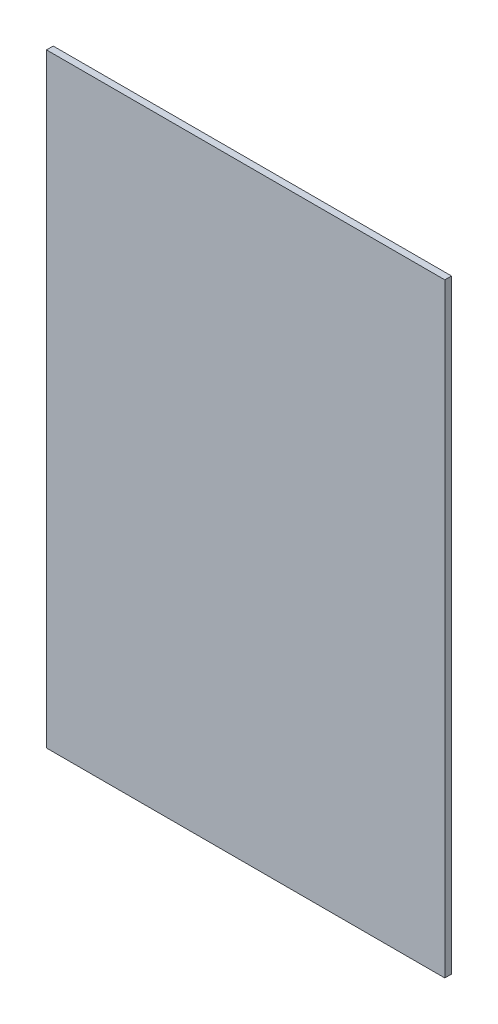
ISO-10303-21;
HEADER;
FILE_DESCRIPTION(('STEP AP214'),'2;1');
FILE_NAME('part.step','',(''),(''),'','','');
FILE_SCHEMA(('AUTOMOTIVE_DESIGN { 1 0 10303 214 1 1 1 1 }'));
ENDSEC;
DATA;
#1=APPLICATION_CONTEXT('core data for automotive mechanical design processes');
#2=APPLICATION_PROTOCOL_DEFINITION('international standard','automotive_design',2000,#1);
#3=PRODUCT_CONTEXT('',#1,'mechanical');
#4=PRODUCT('Part','Part','',(#3));
#5=PRODUCT_RELATED_PRODUCT_CATEGORY('part','',(#4));
#6=PRODUCT_DEFINITION_FORMATION('','',#4);
#7=PRODUCT_DEFINITION_CONTEXT('part definition',#1,'design');
#8=PRODUCT_DEFINITION('design','',#6,#7);
#9=PRODUCT_DEFINITION_SHAPE('','',#8);
#10=(LENGTH_UNIT() NAMED_UNIT(*) SI_UNIT(.MILLI.,.METRE.));
#11=(NAMED_UNIT(*) PLANE_ANGLE_UNIT() SI_UNIT($,.RADIAN.));
#12=(NAMED_UNIT(*) SI_UNIT($,.STERADIAN.) SOLID_ANGLE_UNIT());
#13=UNCERTAINTY_MEASURE_WITH_UNIT(LENGTH_MEASURE(1.E-05),#10,'distance_accuracy_value','');
#14=(GEOMETRIC_REPRESENTATION_CONTEXT(3) GLOBAL_UNCERTAINTY_ASSIGNED_CONTEXT((#13)) GLOBAL_UNIT_ASSIGNED_CONTEXT((#10,
#11,#12)) REPRESENTATION_CONTEXT('',''));
#15=CARTESIAN_POINT('',(0.,0.,0.));
#16=DIRECTION('',(0.,0.,1.));
#17=DIRECTION('',(1.,0.,0.));
#18=AXIS2_PLACEMENT_3D('',#15,#16,#17);
#19=CARTESIAN_POINT('',(0.,0.,7.));
#20=DIRECTION('',(1.,0.,0.));
#21=DIRECTION('',(0.,0.,-1.));
#22=AXIS2_PLACEMENT_3D('',#19,#20,#21);
#23=PLANE('',#22);
#24=DIRECTION('',(0.,-1.,0.));
#25=VECTOR('',#24,1.);
#26=CARTESIAN_POINT('',(0.,0.,0.));
#27=LINE('',#26,#25);
#28=CARTESIAN_POINT('',(0.,630.,0.));
#29=VERTEX_POINT('',#28);
#30=CARTESIAN_POINT('',(0.,0.,0.));
#31=VERTEX_POINT('',#30);
#32=EDGE_CURVE('E195',#29,#31,#27,.T.);
#33=ORIENTED_EDGE('',*,*,#32,.T.);
#34=DIRECTION('',(0.,0.,-1.));
#35=VECTOR('',#34,1.);
#36=CARTESIAN_POINT('',(0.,0.,7.));
#37=LINE('',#36,#35);
#38=CARTESIAN_POINT('',(0.,0.,7.));
#39=VERTEX_POINT('',#38);
#40=EDGE_CURVE('E227',#39,#31,#37,.T.);
#41=ORIENTED_EDGE('',*,*,#40,.F.);
#42=DIRECTION('',(0.,-1.,0.));
#43=VECTOR('',#42,1.);
#44=CARTESIAN_POINT('',(0.,0.,7.));
#45=LINE('',#44,#43);
#46=CARTESIAN_POINT('',(0.,630.,7.));
#47=VERTEX_POINT('',#46);
#48=EDGE_CURVE('E201',#47,#39,#45,.T.);
#49=ORIENTED_EDGE('',*,*,#48,.F.);
#50=DIRECTION('',(0.,0.,-1.));
#51=VECTOR('',#50,1.);
#52=CARTESIAN_POINT('',(0.,630.,7.));
#53=LINE('',#52,#51);
#54=EDGE_CURVE('E211',#47,#29,#53,.T.);
#55=ORIENTED_EDGE('',*,*,#54,.T.);
#56=EDGE_LOOP('',(#33,#41,#49,#55));
#57=FACE_BOUND('',#56,.T.);
#58=ADVANCED_FACE('F37',(#57),#23,.F.);
#59=CARTESIAN_POINT('',(0.,0.,7.));
#60=DIRECTION('',(0.,1.,0.));
#61=DIRECTION('',(0.,0.,1.));
#62=AXIS2_PLACEMENT_3D('',#59,#60,#61);
#63=PLANE('',#62);
#64=DIRECTION('',(1.,0.,0.));
#65=VECTOR('',#64,1.);
#66=CARTESIAN_POINT('',(0.,0.,0.));
#67=LINE('',#66,#65);
#68=CARTESIAN_POINT('',(415.,0.,0.));
#69=VERTEX_POINT('',#68);
#70=EDGE_CURVE('E214',#31,#69,#67,.T.);
#71=ORIENTED_EDGE('',*,*,#70,.T.);
#72=DIRECTION('',(0.,0.,-1.));
#73=VECTOR('',#72,1.);
#74=CARTESIAN_POINT('',(415.,0.,7.));
#75=LINE('',#74,#73);
#76=CARTESIAN_POINT('',(415.,0.,7.));
#77=VERTEX_POINT('',#76);
#78=EDGE_CURVE('E224',#77,#69,#75,.T.);
#79=ORIENTED_EDGE('',*,*,#78,.F.);
#80=DIRECTION('',(1.,0.,0.));
#81=VECTOR('',#80,1.);
#82=CARTESIAN_POINT('',(0.,0.,7.));
#83=LINE('',#82,#81);
#84=EDGE_CURVE('E204',#39,#77,#83,.T.);
#85=ORIENTED_EDGE('',*,*,#84,.F.);
#86=ORIENTED_EDGE('',*,*,#40,.T.);
#87=EDGE_LOOP('',(#71,#79,#85,#86));
#88=FACE_BOUND('',#87,.T.);
#89=ADVANCED_FACE('F311',(#88),#63,.F.);
#90=CARTESIAN_POINT('',(415.,0.,7.));
#91=DIRECTION('',(-1.,0.,0.));
#92=DIRECTION('',(0.,0.,1.));
#93=AXIS2_PLACEMENT_3D('',#90,#91,#92);
#94=PLANE('',#93);
#95=DIRECTION('',(0.,1.,0.));
#96=VECTOR('',#95,1.);
#97=CARTESIAN_POINT('',(415.,0.,0.));
#98=LINE('',#97,#96);
#99=CARTESIAN_POINT('',(415.,630.,0.));
#100=VERTEX_POINT('',#99);
#101=EDGE_CURVE('E216',#69,#100,#98,.T.);
#102=ORIENTED_EDGE('',*,*,#101,.T.);
#103=DIRECTION('',(0.,0.,-1.));
#104=VECTOR('',#103,1.);
#105=CARTESIAN_POINT('',(415.,630.,7.));
#106=LINE('',#105,#104);
#107=CARTESIAN_POINT('',(415.,630.,7.));
#108=VERTEX_POINT('',#107);
#109=EDGE_CURVE('E221',#108,#100,#106,.T.);
#110=ORIENTED_EDGE('',*,*,#109,.F.);
#111=DIRECTION('',(0.,1.,0.));
#112=VECTOR('',#111,1.);
#113=CARTESIAN_POINT('',(415.,0.,7.));
#114=LINE('',#113,#112);
#115=EDGE_CURVE('E207',#77,#108,#114,.T.);
#116=ORIENTED_EDGE('',*,*,#115,.F.);
#117=ORIENTED_EDGE('',*,*,#78,.T.);
#118=EDGE_LOOP('',(#102,#110,#116,#117));
#119=FACE_BOUND('',#118,.T.);
#120=ADVANCED_FACE('F317',(#119),#94,.F.);
#121=CARTESIAN_POINT('',(0.,630.,7.));
#122=DIRECTION('',(0.,-1.,0.));
#123=DIRECTION('',(0.,0.,-1.));
#124=AXIS2_PLACEMENT_3D('',#121,#122,#123);
#125=PLANE('',#124);
#126=DIRECTION('',(-1.,0.,0.));
#127=VECTOR('',#126,1.);
#128=CARTESIAN_POINT('',(0.,630.,0.));
#129=LINE('',#128,#127);
#130=EDGE_CURVE('E205',#100,#29,#129,.T.);
#131=ORIENTED_EDGE('',*,*,#130,.T.);
#132=ORIENTED_EDGE('',*,*,#54,.F.);
#133=DIRECTION('',(-1.,0.,0.));
#134=VECTOR('',#133,1.);
#135=CARTESIAN_POINT('',(0.,630.,7.));
#136=LINE('',#135,#134);
#137=EDGE_CURVE('E209',#108,#47,#136,.T.);
#138=ORIENTED_EDGE('',*,*,#137,.F.);
#139=ORIENTED_EDGE('',*,*,#109,.T.);
#140=EDGE_LOOP('',(#131,#132,#138,#139));
#141=FACE_BOUND('',#140,.T.);
#142=ADVANCED_FACE('F513',(#141),#125,.F.);
#143=CARTESIAN_POINT('',(0.,630.,7.));
#144=DIRECTION('',(0.,0.,-1.));
#145=DIRECTION('',(-1.,0.,0.));
#146=AXIS2_PLACEMENT_3D('',#143,#144,#145);
#147=PLANE('',#146);
#148=ORIENTED_EDGE('',*,*,#48,.T.);
#149=ORIENTED_EDGE('',*,*,#84,.T.);
#150=ORIENTED_EDGE('',*,*,#115,.T.);
#151=ORIENTED_EDGE('',*,*,#137,.T.);
#152=EDGE_LOOP('',(#148,#149,#150,#151));
#153=FACE_BOUND('',#152,.T.);
#154=ADVANCED_FACE('F511',(#153),#147,.F.);
#155=CARTESIAN_POINT('',(0.,630.,0.));
#156=DIRECTION('',(0.,0.,-1.));
#157=DIRECTION('',(-1.,0.,0.));
#158=AXIS2_PLACEMENT_3D('',#155,#156,#157);
#159=PLANE('',#158);
#160=DIRECTION('',(-1.,0.,0.));
#161=VECTOR('',#160,1.);
#162=CARTESIAN_POINT('',(356.9,58.1,0.));
#163=LINE('',#162,#161);
#164=CARTESIAN_POINT('',(356.9,58.1,0.));
#165=VERTEX_POINT('',#164);
#166=CARTESIAN_POINT('',(58.1,58.1,0.));
#167=VERTEX_POINT('',#166);
#168=EDGE_CURVE('E177',#165,#167,#163,.T.);
#169=ORIENTED_EDGE('',*,*,#168,.F.);
#170=DIRECTION('',(0.,-1.,0.));
#171=VECTOR('',#170,1.);
#172=CARTESIAN_POINT('',(356.9,571.9,0.));
#173=LINE('',#172,#171);
#174=CARTESIAN_POINT('',(356.9,571.9,0.));
#175=VERTEX_POINT('',#174);
#176=EDGE_CURVE('E189',#175,#165,#173,.T.);
#177=ORIENTED_EDGE('',*,*,#176,.F.);
#178=DIRECTION('',(1.,0.,0.));
#179=VECTOR('',#178,1.);
#180=CARTESIAN_POINT('',(58.1,571.9,0.));
#181=LINE('',#180,#179);
#182=CARTESIAN_POINT('',(58.1,571.9,0.));
#183=VERTEX_POINT('',#182);
#184=EDGE_CURVE('E186',#183,#175,#181,.T.);
#185=ORIENTED_EDGE('',*,*,#184,.F.);
#186=DIRECTION('',(0.,1.,0.));
#187=VECTOR('',#186,1.);
#188=CARTESIAN_POINT('',(58.1,58.1,0.));
#189=LINE('',#188,#187);
#190=EDGE_CURVE('E183',#167,#183,#189,.T.);
#191=ORIENTED_EDGE('',*,*,#190,.F.);
#192=EDGE_LOOP('',(#169,#177,#185,#191));
#193=FACE_BOUND('',#192,.T.);
#194=ORIENTED_EDGE('',*,*,#32,.F.);
#195=ORIENTED_EDGE('',*,*,#130,.F.);
#196=ORIENTED_EDGE('',*,*,#101,.F.);
#197=ORIENTED_EDGE('',*,*,#70,.F.);
#198=EDGE_LOOP('',(#194,#195,#196,#197));
#199=FACE_BOUND('',#198,.T.);
#200=ADVANCED_FACE('F307',(#193,#199),#159,.T.);
#201=CARTESIAN_POINT('',(356.9,58.1,5.));
#202=DIRECTION('',(0.,-1.,0.));
#203=DIRECTION('',(0.,0.,-1.));
#204=AXIS2_PLACEMENT_3D('',#201,#202,#203);
#205=PLANE('',#204);
#206=DIRECTION('',(0.,0.,-1.));
#207=VECTOR('',#206,1.);
#208=CARTESIAN_POINT('',(58.1,58.1,5.));
#209=LINE('',#208,#207);
#210=CARTESIAN_POINT('',(58.1,58.1,1.00000000000001));
#211=VERTEX_POINT('',#210);
#212=EDGE_CURVE('E192',#211,#167,#209,.T.);
#213=ORIENTED_EDGE('',*,*,#212,.F.);
#214=DIRECTION('',(1.,0.,0.));
#215=VECTOR('',#214,1.);
#216=CARTESIAN_POINT('',(356.9,58.1,1.00000000000001));
#217=LINE('',#216,#215);
#218=CARTESIAN_POINT('',(356.9,58.1,1.00000000000001));
#219=VERTEX_POINT('',#218);
#220=EDGE_CURVE('E255',#211,#219,#217,.T.);
#221=ORIENTED_EDGE('',*,*,#220,.T.);
#222=DIRECTION('',(0.,0.,-1.));
#223=VECTOR('',#222,1.);
#224=CARTESIAN_POINT('',(356.9,58.1,5.));
#225=LINE('',#224,#223);
#226=EDGE_CURVE('E193',#219,#165,#225,.T.);
#227=ORIENTED_EDGE('',*,*,#226,.T.);
#228=ORIENTED_EDGE('',*,*,#168,.T.);
#229=EDGE_LOOP('',(#213,#221,#227,#228));
#230=FACE_BOUND('',#229,.T.);
#231=ADVANCED_FACE('F378',(#230),#205,.F.);
#232=CARTESIAN_POINT('',(356.9,571.9,5.));
#233=DIRECTION('',(1.,0.,0.));
#234=DIRECTION('',(0.,0.,-1.));
#235=AXIS2_PLACEMENT_3D('',#232,#233,#234);
#236=PLANE('',#235);
#237=ORIENTED_EDGE('',*,*,#226,.F.);
#238=DIRECTION('',(0.,1.,0.));
#239=VECTOR('',#238,1.);
#240=CARTESIAN_POINT('',(356.9,571.9,1.00000000000001));
#241=LINE('',#240,#239);
#242=CARTESIAN_POINT('',(356.9,571.9,1.00000000000001));
#243=VERTEX_POINT('',#242);
#244=EDGE_CURVE('E248',#219,#243,#241,.T.);
#245=ORIENTED_EDGE('',*,*,#244,.T.);
#246=DIRECTION('',(0.,0.,-1.));
#247=VECTOR('',#246,1.);
#248=CARTESIAN_POINT('',(356.9,571.9,5.));
#249=LINE('',#248,#247);
#250=EDGE_CURVE('E196',#243,#175,#249,.T.);
#251=ORIENTED_EDGE('',*,*,#250,.T.);
#252=ORIENTED_EDGE('',*,*,#176,.T.);
#253=EDGE_LOOP('',(#237,#245,#251,#252));
#254=FACE_BOUND('',#253,.T.);
#255=ADVANCED_FACE('F383',(#254),#236,.F.);
#256=CARTESIAN_POINT('',(58.1,571.9,5.));
#257=DIRECTION('',(0.,1.,0.));
#258=DIRECTION('',(0.,0.,1.));
#259=AXIS2_PLACEMENT_3D('',#256,#257,#258);
#260=PLANE('',#259);
#261=ORIENTED_EDGE('',*,*,#250,.F.);
#262=DIRECTION('',(-1.,0.,0.));
#263=VECTOR('',#262,1.);
#264=CARTESIAN_POINT('',(58.1,571.9,1.00000000000001));
#265=LINE('',#264,#263);
#266=CARTESIAN_POINT('',(58.1,571.9,1.00000000000001));
#267=VERTEX_POINT('',#266);
#268=EDGE_CURVE('E251',#243,#267,#265,.T.);
#269=ORIENTED_EDGE('',*,*,#268,.T.);
#270=DIRECTION('',(0.,0.,-1.));
#271=VECTOR('',#270,1.);
#272=CARTESIAN_POINT('',(58.1,571.9,5.));
#273=LINE('',#272,#271);
#274=EDGE_CURVE('E198',#267,#183,#273,.T.);
#275=ORIENTED_EDGE('',*,*,#274,.T.);
#276=ORIENTED_EDGE('',*,*,#184,.T.);
#277=EDGE_LOOP('',(#261,#269,#275,#276));
#278=FACE_BOUND('',#277,.T.);
#279=ADVANCED_FACE('F393',(#278),#260,.F.);
#280=CARTESIAN_POINT('',(58.1,58.1,5.));
#281=DIRECTION('',(-1.,0.,0.));
#282=DIRECTION('',(0.,0.,1.));
#283=AXIS2_PLACEMENT_3D('',#280,#281,#282);
#284=PLANE('',#283);
#285=ORIENTED_EDGE('',*,*,#274,.F.);
#286=DIRECTION('',(0.,-1.,0.));
#287=VECTOR('',#286,1.);
#288=CARTESIAN_POINT('',(58.1,58.1,1.00000000000001));
#289=LINE('',#288,#287);
#290=EDGE_CURVE('E253',#267,#211,#289,.T.);
#291=ORIENTED_EDGE('',*,*,#290,.T.);
#292=ORIENTED_EDGE('',*,*,#212,.T.);
#293=ORIENTED_EDGE('',*,*,#190,.T.);
#294=EDGE_LOOP('',(#285,#291,#292,#293));
#295=FACE_BOUND('',#294,.T.);
#296=ADVANCED_FACE('F404',(#295),#284,.F.);
#297=CARTESIAN_POINT('',(58.1,58.1,5.));
#298=DIRECTION('',(0.,0.,-1.));
#299=DIRECTION('',(-1.,0.,0.));
#300=AXIS2_PLACEMENT_3D('',#297,#298,#299);
#301=PLANE('',#300);
#302=DIRECTION('',(1.,0.,0.));
#303=VECTOR('',#302,1.);
#304=CARTESIAN_POINT('',(58.1,567.9,5.));
#305=LINE('',#304,#303);
#306=CARTESIAN_POINT('',(62.1,567.9,5.));
#307=VERTEX_POINT('',#306);
#308=CARTESIAN_POINT('',(352.9,567.9,5.));
#309=VERTEX_POINT('',#308);
#310=EDGE_CURVE('E243',#307,#309,#305,.T.);
#311=ORIENTED_EDGE('',*,*,#310,.T.);
#312=DIRECTION('',(0.,-1.,0.));
#313=VECTOR('',#312,1.);
#314=CARTESIAN_POINT('',(352.9,58.1,5.));
#315=LINE('',#314,#313);
#316=CARTESIAN_POINT('',(352.9,62.1,5.));
#317=VERTEX_POINT('',#316);
#318=EDGE_CURVE('E245',#309,#317,#315,.T.);
#319=ORIENTED_EDGE('',*,*,#318,.T.);
#320=DIRECTION('',(-1.,0.,0.));
#321=VECTOR('',#320,1.);
#322=CARTESIAN_POINT('',(58.1,62.1,5.));
#323=LINE('',#322,#321);
#324=CARTESIAN_POINT('',(62.1,62.1,5.));
#325=VERTEX_POINT('',#324);
#326=EDGE_CURVE('E239',#317,#325,#323,.T.);
#327=ORIENTED_EDGE('',*,*,#326,.T.);
#328=DIRECTION('',(0.,1.,0.));
#329=VECTOR('',#328,1.);
#330=CARTESIAN_POINT('',(62.1,58.1,5.));
#331=LINE('',#330,#329);
#332=EDGE_CURVE('E241',#325,#307,#331,.T.);
#333=ORIENTED_EDGE('',*,*,#332,.T.);
#334=EDGE_LOOP('',(#311,#319,#327,#333));
#335=FACE_BOUND('',#334,.T.);
#336=DIRECTION('',(0.,-1.,0.));
#337=VECTOR('',#336,1.);
#338=CARTESIAN_POINT('',(121.3,125.3,5.));
#339=LINE('',#338,#337);
#340=CARTESIAN_POINT('',(121.3,508.7,5.));
#341=VERTEX_POINT('',#340);
#342=CARTESIAN_POINT('',(121.3,121.3,5.));
#343=VERTEX_POINT('',#342);
#344=EDGE_CURVE('E234',#341,#343,#339,.T.);
#345=ORIENTED_EDGE('',*,*,#344,.T.);
#346=DIRECTION('',(1.,0.,0.));
#347=VECTOR('',#346,1.);
#348=CARTESIAN_POINT('',(289.7,121.3,5.));
#349=LINE('',#348,#347);
#350=CARTESIAN_POINT('',(293.7,121.3,5.));
#351=VERTEX_POINT('',#350);
#352=EDGE_CURVE('E236',#343,#351,#349,.T.);
#353=ORIENTED_EDGE('',*,*,#352,.T.);
#354=DIRECTION('',(0.,1.,0.));
#355=VECTOR('',#354,1.);
#356=CARTESIAN_POINT('',(293.7,504.7,5.));
#357=LINE('',#356,#355);
#358=CARTESIAN_POINT('',(293.7,508.7,5.));
#359=VERTEX_POINT('',#358);
#360=EDGE_CURVE('E230',#351,#359,#357,.T.);
#361=ORIENTED_EDGE('',*,*,#360,.T.);
#362=DIRECTION('',(-1.,0.,0.));
#363=VECTOR('',#362,1.);
#364=CARTESIAN_POINT('',(125.3,508.7,5.));
#365=LINE('',#364,#363);
#366=EDGE_CURVE('E232',#359,#341,#365,.T.);
#367=ORIENTED_EDGE('',*,*,#366,.T.);
#368=EDGE_LOOP('',(#345,#353,#361,#367));
#369=FACE_BOUND('',#368,.T.);
#370=ADVANCED_FACE('F289',(#335,#369),#301,.T.);
#371=CARTESIAN_POINT('',(289.7,125.3,5.));
#372=DIRECTION('',(0.,-1.,0.));
#373=DIRECTION('',(0.,0.,-1.));
#374=AXIS2_PLACEMENT_3D('',#371,#372,#373);
#375=PLANE('',#374);
#376=DIRECTION('',(0.,0.,-1.));
#377=VECTOR('',#376,1.);
#378=CARTESIAN_POINT('',(289.7,125.3,5.));
#379=LINE('',#378,#377);
#380=CARTESIAN_POINT('',(289.7,125.3,0.999999999999969));
#381=VERTEX_POINT('',#380);
#382=CARTESIAN_POINT('',(289.7,125.3,0.));
#383=VERTEX_POINT('',#382);
#384=EDGE_CURVE('E157',#381,#383,#379,.T.);
#385=ORIENTED_EDGE('',*,*,#384,.F.);
#386=DIRECTION('',(-1.,0.,0.));
#387=VECTOR('',#386,1.);
#388=CARTESIAN_POINT('',(125.3,125.3,0.999999999999969));
#389=LINE('',#388,#387);
#390=CARTESIAN_POINT('',(125.3,125.3,0.999999999999969));
#391=VERTEX_POINT('',#390);
#392=EDGE_CURVE('E257',#381,#391,#389,.T.);
#393=ORIENTED_EDGE('',*,*,#392,.T.);
#394=DIRECTION('',(0.,0.,-1.));
#395=VECTOR('',#394,1.);
#396=CARTESIAN_POINT('',(125.3,125.3,5.));
#397=LINE('',#396,#395);
#398=CARTESIAN_POINT('',(125.3,125.3,0.));
#399=VERTEX_POINT('',#398);
#400=EDGE_CURVE('E167',#391,#399,#397,.T.);
#401=ORIENTED_EDGE('',*,*,#400,.T.);
#402=DIRECTION('',(-1.,0.,0.));
#403=VECTOR('',#402,1.);
#404=CARTESIAN_POINT('',(289.7,125.3,0.));
#405=LINE('',#404,#403);
#406=EDGE_CURVE('E173',#383,#399,#405,.T.);
#407=ORIENTED_EDGE('',*,*,#406,.F.);
#408=EDGE_LOOP('',(#385,#393,#401,#407));
#409=FACE_BOUND('',#408,.T.);
#410=ADVANCED_FACE('F297',(#409),#375,.T.);
#411=CARTESIAN_POINT('',(289.7,504.7,5.));
#412=DIRECTION('',(1.,0.,0.));
#413=DIRECTION('',(0.,0.,-1.));
#414=AXIS2_PLACEMENT_3D('',#411,#412,#413);
#415=PLANE('',#414);
#416=DIRECTION('',(0.,0.,-1.));
#417=VECTOR('',#416,1.);
#418=CARTESIAN_POINT('',(289.7,504.7,5.));
#419=LINE('',#418,#417);
#420=CARTESIAN_POINT('',(289.7,504.7,0.999999999999969));
#421=VERTEX_POINT('',#420);
#422=CARTESIAN_POINT('',(289.7,504.7,0.));
#423=VERTEX_POINT('',#422);
#424=EDGE_CURVE('E149',#421,#423,#419,.T.);
#425=ORIENTED_EDGE('',*,*,#424,.F.);
#426=DIRECTION('',(0.,-1.,0.));
#427=VECTOR('',#426,1.);
#428=CARTESIAN_POINT('',(289.7,125.3,0.999999999999969));
#429=LINE('',#428,#427);
#430=EDGE_CURVE('E11',#421,#381,#429,.T.);
#431=ORIENTED_EDGE('',*,*,#430,.T.);
#432=ORIENTED_EDGE('',*,*,#384,.T.);
#433=DIRECTION('',(0.,-1.,0.));
#434=VECTOR('',#433,1.);
#435=CARTESIAN_POINT('',(289.7,504.7,0.));
#436=LINE('',#435,#434);
#437=EDGE_CURVE('E161',#423,#383,#436,.T.);
#438=ORIENTED_EDGE('',*,*,#437,.F.);
#439=EDGE_LOOP('',(#425,#431,#432,#438));
#440=FACE_BOUND('',#439,.T.);
#441=ADVANCED_FACE('F162',(#440),#415,.T.);
#442=CARTESIAN_POINT('',(125.3,504.7,5.));
#443=DIRECTION('',(0.,1.,0.));
#444=DIRECTION('',(0.,0.,1.));
#445=AXIS2_PLACEMENT_3D('',#442,#443,#444);
#446=PLANE('',#445);
#447=DIRECTION('',(0.,0.,-1.));
#448=VECTOR('',#447,1.);
#449=CARTESIAN_POINT('',(125.3,504.7,5.));
#450=LINE('',#449,#448);
#451=CARTESIAN_POINT('',(125.3,504.7,0.999999999999969));
#452=VERTEX_POINT('',#451);
#453=CARTESIAN_POINT('',(125.3,504.7,0.));
#454=VERTEX_POINT('',#453);
#455=EDGE_CURVE('E158',#452,#454,#450,.T.);
#456=ORIENTED_EDGE('',*,*,#455,.F.);
#457=DIRECTION('',(1.,0.,0.));
#458=VECTOR('',#457,1.);
#459=CARTESIAN_POINT('',(289.7,504.7,0.999999999999969));
#460=LINE('',#459,#458);
#461=EDGE_CURVE('E46',#452,#421,#460,.T.);
#462=ORIENTED_EDGE('',*,*,#461,.T.);
#463=ORIENTED_EDGE('',*,*,#424,.T.);
#464=DIRECTION('',(1.,0.,0.));
#465=VECTOR('',#464,1.);
#466=CARTESIAN_POINT('',(125.3,504.7,0.));
#467=LINE('',#466,#465);
#468=EDGE_CURVE('E153',#454,#423,#467,.T.);
#469=ORIENTED_EDGE('',*,*,#468,.F.);
#470=EDGE_LOOP('',(#456,#462,#463,#469));
#471=FACE_BOUND('',#470,.T.);
#472=ADVANCED_FACE('F151',(#471),#446,.T.);
#473=CARTESIAN_POINT('',(125.3,125.3,5.));
#474=DIRECTION('',(-1.,0.,0.));
#475=DIRECTION('',(0.,0.,1.));
#476=AXIS2_PLACEMENT_3D('',#473,#474,#475);
#477=PLANE('',#476);
#478=ORIENTED_EDGE('',*,*,#400,.F.);
#479=DIRECTION('',(0.,1.,0.));
#480=VECTOR('',#479,1.);
#481=CARTESIAN_POINT('',(125.3,504.7,0.999999999999969));
#482=LINE('',#481,#480);
#483=EDGE_CURVE('E61',#391,#452,#482,.T.);
#484=ORIENTED_EDGE('',*,*,#483,.T.);
#485=ORIENTED_EDGE('',*,*,#455,.T.);
#486=DIRECTION('',(0.,1.,0.));
#487=VECTOR('',#486,1.);
#488=CARTESIAN_POINT('',(125.3,125.3,0.));
#489=LINE('',#488,#487);
#490=EDGE_CURVE('E171',#399,#454,#489,.T.);
#491=ORIENTED_EDGE('',*,*,#490,.F.);
#492=EDGE_LOOP('',(#478,#484,#485,#491));
#493=FACE_BOUND('',#492,.T.);
#494=ADVANCED_FACE('F298',(#493),#477,.T.);
#495=ORIENTED_EDGE('',*,*,#437,.T.);
#496=ORIENTED_EDGE('',*,*,#406,.T.);
#497=ORIENTED_EDGE('',*,*,#490,.T.);
#498=ORIENTED_EDGE('',*,*,#468,.T.);
#499=EDGE_LOOP('',(#495,#496,#497,#498));
#500=FACE_BOUND('',#499,.T.);
#501=ADVANCED_FACE('F169',(#500),#159,.T.);
#502=CARTESIAN_POINT('',(62.1,58.1,5.));
#503=DIRECTION('',(-0.707106781186544,0.,0.707106781186551));
#504=DIRECTION('',(0.707106781186551,0.,0.707106781186544));
#505=AXIS2_PLACEMENT_3D('',#502,#503,#504);
#506=PLANE('',#505);
#507=DIRECTION('',(0.577350269189628,0.577350269189628,0.577350269189622));
#508=VECTOR('',#507,1.);
#509=CARTESIAN_POINT('',(60.7666666666667,60.7666666666667,3.66666666666666));
#510=LINE('',#509,#508);
#511=EDGE_CURVE('E266',#211,#325,#510,.T.);
#512=ORIENTED_EDGE('',*,*,#511,.F.);
#513=ORIENTED_EDGE('',*,*,#290,.F.);
#514=DIRECTION('',(0.577350269189629,-0.577350269189626,0.577350269189623));
#515=VECTOR('',#514,1.);
#516=CARTESIAN_POINT('',(60.7666666666667,569.233333333333,3.66666666666666));
#517=LINE('',#516,#515);
#518=EDGE_CURVE('E269',#307,#267,#517,.F.);
#519=ORIENTED_EDGE('',*,*,#518,.F.);
#520=ORIENTED_EDGE('',*,*,#332,.F.);
#521=EDGE_LOOP('',(#512,#513,#519,#520));
#522=FACE_BOUND('',#521,.T.);
#523=ADVANCED_FACE('F305',(#522),#506,.F.);
#524=CARTESIAN_POINT('',(58.1,567.9,5.));
#525=DIRECTION('',(0.,0.707106781186546,0.707106781186549));
#526=DIRECTION('',(0.,-0.707106781186549,0.707106781186546));
#527=AXIS2_PLACEMENT_3D('',#524,#525,#526);
#528=PLANE('',#527);
#529=ORIENTED_EDGE('',*,*,#518,.T.);
#530=ORIENTED_EDGE('',*,*,#268,.F.);
#531=DIRECTION('',(-0.577350269189627,-0.577350269189627,0.577350269189624));
#532=VECTOR('',#531,1.);
#533=CARTESIAN_POINT('',(182.966666666666,397.966666666666,174.933333333333));
#534=LINE('',#533,#532);
#535=EDGE_CURVE('E264',#309,#243,#534,.F.);
#536=ORIENTED_EDGE('',*,*,#535,.F.);
#537=ORIENTED_EDGE('',*,*,#310,.F.);
#538=EDGE_LOOP('',(#529,#530,#536,#537));
#539=FACE_BOUND('',#538,.T.);
#540=ADVANCED_FACE('F329',(#539),#528,.F.);
#541=CARTESIAN_POINT('',(58.1,62.1,5.));
#542=DIRECTION('',(0.,-0.707106781186544,0.707106781186551));
#543=DIRECTION('',(0.,-0.707106781186551,-0.707106781186544));
#544=AXIS2_PLACEMENT_3D('',#541,#542,#543);
#545=PLANE('',#544);
#546=ORIENTED_EDGE('',*,*,#511,.T.);
#547=ORIENTED_EDGE('',*,*,#326,.F.);
#548=DIRECTION('',(0.577350269189626,-0.577350269189629,-0.577350269189623));
#549=VECTOR('',#548,1.);
#550=CARTESIAN_POINT('',(354.233333333333,60.7666666666667,3.66666666666666));
#551=LINE('',#550,#549);
#552=EDGE_CURVE('E262',#219,#317,#551,.F.);
#553=ORIENTED_EDGE('',*,*,#552,.F.);
#554=ORIENTED_EDGE('',*,*,#220,.F.);
#555=EDGE_LOOP('',(#546,#547,#553,#554));
#556=FACE_BOUND('',#555,.T.);
#557=ADVANCED_FACE('F325',(#556),#545,.F.);
#558=CARTESIAN_POINT('',(352.9,58.1,5.));
#559=DIRECTION('',(0.707106781186546,0.,0.707106781186549));
#560=DIRECTION('',(0.707106781186549,0.,-0.707106781186546));
#561=AXIS2_PLACEMENT_3D('',#558,#559,#560);
#562=PLANE('',#561);
#563=ORIENTED_EDGE('',*,*,#535,.T.);
#564=ORIENTED_EDGE('',*,*,#244,.F.);
#565=ORIENTED_EDGE('',*,*,#552,.T.);
#566=ORIENTED_EDGE('',*,*,#318,.F.);
#567=EDGE_LOOP('',(#563,#564,#565,#566));
#568=FACE_BOUND('',#567,.T.);
#569=ADVANCED_FACE('F322',(#568),#562,.F.);
#570=CARTESIAN_POINT('',(125.3,504.7,0.999999999999969));
#571=DIRECTION('',(0.,0.70710678118655,-0.707106781186545));
#572=DIRECTION('',(0.,0.707106781186545,0.70710678118655));
#573=AXIS2_PLACEMENT_3D('',#570,#571,#572);
#574=PLANE('',#573);
#575=DIRECTION('',(-0.577350269189624,0.577350269189624,0.577350269189628));
#576=VECTOR('',#575,1.);
#577=CARTESIAN_POINT('',(125.3,504.7,0.999999999999969));
#578=LINE('',#577,#576);
#579=EDGE_CURVE('E275',#341,#452,#578,.F.);
#580=ORIENTED_EDGE('',*,*,#579,.F.);
#581=ORIENTED_EDGE('',*,*,#366,.F.);
#582=DIRECTION('',(0.577350269189624,0.577350269189624,0.577350269189628));
#583=VECTOR('',#582,1.);
#584=CARTESIAN_POINT('',(289.7,504.7,0.999999999999969));
#585=LINE('',#584,#583);
#586=EDGE_CURVE('E41',#421,#359,#585,.T.);
#587=ORIENTED_EDGE('',*,*,#586,.F.);
#588=ORIENTED_EDGE('',*,*,#461,.F.);
#589=EDGE_LOOP('',(#580,#581,#587,#588));
#590=FACE_BOUND('',#589,.T.);
#591=ADVANCED_FACE('F39',(#590),#574,.T.);
#592=CARTESIAN_POINT('',(289.7,504.7,0.999999999999969));
#593=DIRECTION('',(0.70710678118655,0.,-0.707106781186545));
#594=DIRECTION('',(-0.707106781186545,0.,-0.70710678118655));
#595=AXIS2_PLACEMENT_3D('',#592,#593,#594);
#596=PLANE('',#595);
#597=ORIENTED_EDGE('',*,*,#586,.T.);
#598=ORIENTED_EDGE('',*,*,#360,.F.);
#599=DIRECTION('',(-0.577350269189624,0.577350269189624,-0.577350269189628));
#600=VECTOR('',#599,1.);
#601=CARTESIAN_POINT('',(163.233333333334,251.766666666666,-125.466666666667));
#602=LINE('',#601,#600);
#603=EDGE_CURVE('E274',#381,#351,#602,.F.);
#604=ORIENTED_EDGE('',*,*,#603,.F.);
#605=ORIENTED_EDGE('',*,*,#430,.F.);
#606=EDGE_LOOP('',(#597,#598,#604,#605));
#607=FACE_BOUND('',#606,.T.);
#608=ADVANCED_FACE('F284',(#607),#596,.T.);
#609=CARTESIAN_POINT('',(125.3,125.3,0.999999999999969));
#610=DIRECTION('',(-0.70710678118655,0.,-0.707106781186545));
#611=DIRECTION('',(-0.707106781186545,0.,0.70710678118655));
#612=AXIS2_PLACEMENT_3D('',#609,#610,#611);
#613=PLANE('',#612);
#614=ORIENTED_EDGE('',*,*,#579,.T.);
#615=ORIENTED_EDGE('',*,*,#483,.F.);
#616=DIRECTION('',(-0.577350269189624,-0.577350269189624,0.577350269189628));
#617=VECTOR('',#616,1.);
#618=CARTESIAN_POINT('',(125.3,125.3,0.999999999999969));
#619=LINE('',#618,#617);
#620=EDGE_CURVE('E272',#343,#391,#619,.F.);
#621=ORIENTED_EDGE('',*,*,#620,.F.);
#622=ORIENTED_EDGE('',*,*,#344,.F.);
#623=EDGE_LOOP('',(#614,#615,#621,#622));
#624=FACE_BOUND('',#623,.T.);
#625=ADVANCED_FACE('F295',(#624),#613,.T.);
#626=CARTESIAN_POINT('',(289.7,125.3,0.999999999999969));
#627=DIRECTION('',(0.,-0.70710678118655,-0.707106781186545));
#628=DIRECTION('',(0.,0.707106781186545,-0.70710678118655));
#629=AXIS2_PLACEMENT_3D('',#626,#627,#628);
#630=PLANE('',#629);
#631=ORIENTED_EDGE('',*,*,#603,.T.);
#632=ORIENTED_EDGE('',*,*,#352,.F.);
#633=ORIENTED_EDGE('',*,*,#620,.T.);
#634=ORIENTED_EDGE('',*,*,#392,.F.);
#635=EDGE_LOOP('',(#631,#632,#633,#634));
#636=FACE_BOUND('',#635,.T.);
#637=ADVANCED_FACE('F293',(#636),#630,.T.);
#638=CLOSED_SHELL('',(#58,#89,#120,#142,#154,#200,#231,#255,#279,#296,#370,#410,#441,#472,#494,
#501,#523,#540,#557,#569,#591,#608,#625,#637));
#639=MANIFOLD_SOLID_BREP('B2',#638);
#640=ADVANCED_BREP_SHAPE_REPRESENTATION('',(#18,#639),#14);
#641=SHAPE_DEFINITION_REPRESENTATION(#9,#640);
ENDSEC;
END-ISO-10303-21;
